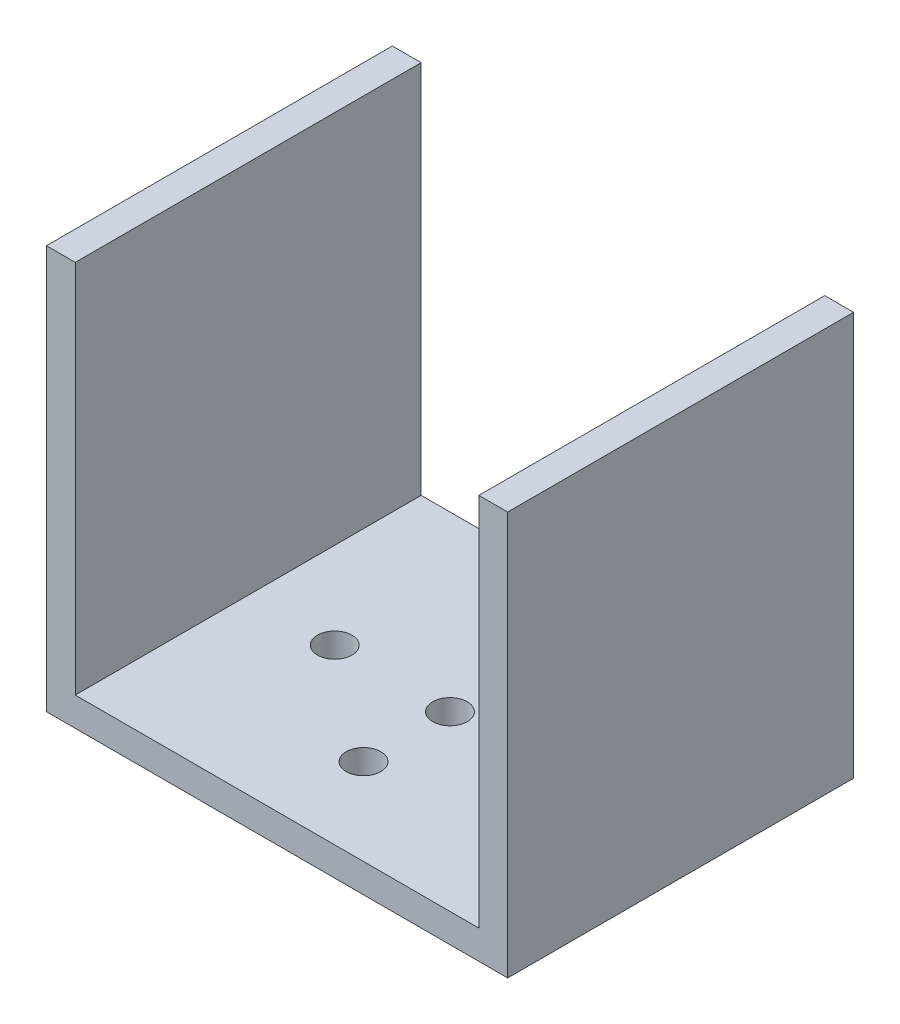
ISO-10303-21;
HEADER;
FILE_DESCRIPTION(('STEP AP214'),'2;1');
FILE_NAME('part.step','',(''),(''),'','','');
FILE_SCHEMA(('AUTOMOTIVE_DESIGN { 1 0 10303 214 1 1 1 1 }'));
ENDSEC;
DATA;
#1=APPLICATION_CONTEXT('core data for automotive mechanical design processes');
#2=APPLICATION_PROTOCOL_DEFINITION('international standard','automotive_design',2000,#1);
#3=PRODUCT_CONTEXT('',#1,'mechanical');
#4=PRODUCT('Part','Part','',(#3));
#5=PRODUCT_RELATED_PRODUCT_CATEGORY('part','',(#4));
#6=PRODUCT_DEFINITION_FORMATION('','',#4);
#7=PRODUCT_DEFINITION_CONTEXT('part definition',#1,'design');
#8=PRODUCT_DEFINITION('design','',#6,#7);
#9=PRODUCT_DEFINITION_SHAPE('','',#8);
#10=(LENGTH_UNIT() NAMED_UNIT(*) SI_UNIT(.MILLI.,.METRE.));
#11=(NAMED_UNIT(*) PLANE_ANGLE_UNIT() SI_UNIT($,.RADIAN.));
#12=(NAMED_UNIT(*) SI_UNIT($,.STERADIAN.) SOLID_ANGLE_UNIT());
#13=UNCERTAINTY_MEASURE_WITH_UNIT(LENGTH_MEASURE(1.E-05),#10,'distance_accuracy_value','');
#14=(GEOMETRIC_REPRESENTATION_CONTEXT(3) GLOBAL_UNCERTAINTY_ASSIGNED_CONTEXT((#13)) GLOBAL_UNIT_ASSIGNED_CONTEXT((#10,
#11,#12)) REPRESENTATION_CONTEXT('',''));
#15=CARTESIAN_POINT('',(0.,0.,0.));
#16=DIRECTION('',(0.,0.,1.));
#17=DIRECTION('',(1.,0.,0.));
#18=AXIS2_PLACEMENT_3D('',#15,#16,#17);
#19=CARTESIAN_POINT('',(0.,4.99999999999999,-60.));
#20=DIRECTION('',(0.,1.,0.));
#21=DIRECTION('',(-1.,0.,0.));
#22=AXIS2_PLACEMENT_3D('',#19,#20,#21);
#23=PLANE('',#22);
#24=CARTESIAN_POINT('',(20.,4.99999999999999,-30.));
#25=DIRECTION('',(0.,1.,0.));
#26=DIRECTION('',(-1.,0.,0.));
#27=AXIS2_PLACEMENT_3D('',#24,#25,#26);
#28=CIRCLE('',#27,3.);
#29=CARTESIAN_POINT('',(17.,4.99999999999999,-30.));
#30=VERTEX_POINT('',#29);
#31=EDGE_CURVE('E252',#30,#30,#28,.T.);
#32=ORIENTED_EDGE('',*,*,#31,.F.);
#33=EDGE_LOOP('',(#32));
#34=FACE_BOUND('',#33,.T.);
#35=CARTESIAN_POINT('',(40.,4.99999999999999,-45.));
#36=DIRECTION('',(0.,1.,0.));
#37=DIRECTION('',(-1.,0.,0.));
#38=AXIS2_PLACEMENT_3D('',#35,#36,#37);
#39=CIRCLE('',#38,2.99999999999999);
#40=CARTESIAN_POINT('',(37.,4.99999999999999,-45.));
#41=VERTEX_POINT('',#40);
#42=EDGE_CURVE('E243',#41,#41,#39,.T.);
#43=ORIENTED_EDGE('',*,*,#42,.F.);
#44=EDGE_LOOP('',(#43));
#45=FACE_BOUND('',#44,.T.);
#46=CARTESIAN_POINT('',(40.,4.99999999999999,-15.));
#47=DIRECTION('',(0.,1.,0.));
#48=DIRECTION('',(1.,0.,0.));
#49=AXIS2_PLACEMENT_3D('',#46,#47,#48);
#50=CIRCLE('',#49,2.99999999999999);
#51=CARTESIAN_POINT('',(43.,4.99999999999999,-15.));
#52=VERTEX_POINT('',#51);
#53=EDGE_CURVE('E267',#52,#52,#50,.T.);
#54=ORIENTED_EDGE('',*,*,#53,.F.);
#55=EDGE_LOOP('',(#54));
#56=FACE_BOUND('',#55,.T.);
#57=CARTESIAN_POINT('',(60.,5.,-30.));
#58=DIRECTION('',(0.,1.,0.));
#59=DIRECTION('',(1.,0.,0.));
#60=AXIS2_PLACEMENT_3D('',#57,#58,#59);
#61=CIRCLE('',#60,3.00000000000001);
#62=CARTESIAN_POINT('',(63.,5.,-30.));
#63=VERTEX_POINT('',#62);
#64=EDGE_CURVE('E259',#63,#63,#61,.T.);
#65=ORIENTED_EDGE('',*,*,#64,.F.);
#66=EDGE_LOOP('',(#65));
#67=FACE_BOUND('',#66,.T.);
#68=CARTESIAN_POINT('',(40.,4.99999999999999,-30.));
#69=DIRECTION('',(0.,1.,0.));
#70=DIRECTION('',(-1.,0.,0.));
#71=AXIS2_PLACEMENT_3D('',#68,#69,#70);
#72=CIRCLE('',#71,3.);
#73=CARTESIAN_POINT('',(37.,4.99999999999999,-30.));
#74=VERTEX_POINT('',#73);
#75=EDGE_CURVE('E235',#74,#74,#72,.T.);
#76=ORIENTED_EDGE('',*,*,#75,.F.);
#77=EDGE_LOOP('',(#76));
#78=FACE_BOUND('',#77,.T.);
#79=DIRECTION('',(-1.,0.,0.));
#80=VECTOR('',#79,1.);
#81=CARTESIAN_POINT('',(0.,4.99999999999999,0.));
#82=LINE('',#81,#80);
#83=CARTESIAN_POINT('',(75.,5.,0.));
#84=VERTEX_POINT('',#83);
#85=CARTESIAN_POINT('',(5.00000000000001,4.99999999999999,0.));
#86=VERTEX_POINT('',#85);
#87=EDGE_CURVE('E145',#84,#86,#82,.T.);
#88=ORIENTED_EDGE('',*,*,#87,.F.);
#89=DIRECTION('',(0.,0.,1.));
#90=VECTOR('',#89,1.);
#91=CARTESIAN_POINT('',(75.,5.,-60.));
#92=LINE('',#91,#90);
#93=CARTESIAN_POINT('',(75.,5.,-60.));
#94=VERTEX_POINT('',#93);
#95=EDGE_CURVE('E11',#94,#84,#92,.T.);
#96=ORIENTED_EDGE('',*,*,#95,.F.);
#97=DIRECTION('',(-1.,0.,0.));
#98=VECTOR('',#97,1.);
#99=CARTESIAN_POINT('',(0.,4.99999999999999,-60.));
#100=LINE('',#99,#98);
#101=CARTESIAN_POINT('',(5.00000000000001,4.99999999999999,-60.));
#102=VERTEX_POINT('',#101);
#103=EDGE_CURVE('E172',#94,#102,#100,.T.);
#104=ORIENTED_EDGE('',*,*,#103,.T.);
#105=DIRECTION('',(0.,0.,1.));
#106=VECTOR('',#105,1.);
#107=CARTESIAN_POINT('',(5.00000000000001,4.99999999999999,-60.));
#108=LINE('',#107,#106);
#109=EDGE_CURVE('E44',#102,#86,#108,.T.);
#110=ORIENTED_EDGE('',*,*,#109,.T.);
#111=EDGE_LOOP('',(#88,#96,#104,#110));
#112=FACE_BOUND('',#111,.T.);
#113=ADVANCED_FACE('F41',(#34,#45,#56,#67,#78,#112),#23,.T.);
#114=CARTESIAN_POINT('',(75.,0.,-60.));
#115=DIRECTION('',(-1.,0.,0.));
#116=DIRECTION('',(0.,-1.,0.));
#117=AXIS2_PLACEMENT_3D('',#114,#115,#116);
#118=PLANE('',#117);
#119=DIRECTION('',(0.,-1.,0.));
#120=VECTOR('',#119,1.);
#121=CARTESIAN_POINT('',(75.,0.,0.));
#122=LINE('',#121,#120);
#123=CARTESIAN_POINT('',(75.,70.,0.));
#124=VERTEX_POINT('',#123);
#125=EDGE_CURVE('E169',#124,#84,#122,.T.);
#126=ORIENTED_EDGE('',*,*,#125,.F.);
#127=DIRECTION('',(0.,0.,1.));
#128=VECTOR('',#127,1.);
#129=CARTESIAN_POINT('',(75.,70.,-60.));
#130=LINE('',#129,#128);
#131=CARTESIAN_POINT('',(75.,70.,-60.));
#132=VERTEX_POINT('',#131);
#133=EDGE_CURVE('E51',#132,#124,#130,.T.);
#134=ORIENTED_EDGE('',*,*,#133,.F.);
#135=DIRECTION('',(0.,-1.,0.));
#136=VECTOR('',#135,1.);
#137=CARTESIAN_POINT('',(75.,0.,-60.));
#138=LINE('',#137,#136);
#139=EDGE_CURVE('E130',#132,#94,#138,.T.);
#140=ORIENTED_EDGE('',*,*,#139,.T.);
#141=ORIENTED_EDGE('',*,*,#95,.T.);
#142=EDGE_LOOP('',(#126,#134,#140,#141));
#143=FACE_BOUND('',#142,.T.);
#144=ADVANCED_FACE('F190',(#143),#118,.T.);
#145=CARTESIAN_POINT('',(0.,70.,-60.));
#146=DIRECTION('',(0.,1.,0.));
#147=DIRECTION('',(-1.,0.,0.));
#148=AXIS2_PLACEMENT_3D('',#145,#146,#147);
#149=PLANE('',#148);
#150=DIRECTION('',(-1.,0.,0.));
#151=VECTOR('',#150,1.);
#152=CARTESIAN_POINT('',(0.,70.,0.));
#153=LINE('',#152,#151);
#154=CARTESIAN_POINT('',(80.,70.,0.));
#155=VERTEX_POINT('',#154);
#156=EDGE_CURVE('E116',#155,#124,#153,.T.);
#157=ORIENTED_EDGE('',*,*,#156,.F.);
#158=DIRECTION('',(0.,0.,1.));
#159=VECTOR('',#158,1.);
#160=CARTESIAN_POINT('',(80.,70.,-60.));
#161=LINE('',#160,#159);
#162=CARTESIAN_POINT('',(80.,70.,-60.));
#163=VERTEX_POINT('',#162);
#164=EDGE_CURVE('E111',#163,#155,#161,.T.);
#165=ORIENTED_EDGE('',*,*,#164,.F.);
#166=DIRECTION('',(-1.,0.,0.));
#167=VECTOR('',#166,1.);
#168=CARTESIAN_POINT('',(0.,70.,-60.));
#169=LINE('',#168,#167);
#170=EDGE_CURVE('E114',#163,#132,#169,.T.);
#171=ORIENTED_EDGE('',*,*,#170,.T.);
#172=ORIENTED_EDGE('',*,*,#133,.T.);
#173=EDGE_LOOP('',(#157,#165,#171,#172));
#174=FACE_BOUND('',#173,.T.);
#175=ADVANCED_FACE('F113',(#174),#149,.T.);
#176=CARTESIAN_POINT('',(80.,0.,-60.));
#177=DIRECTION('',(1.,0.,0.));
#178=DIRECTION('',(0.,0.,-1.));
#179=AXIS2_PLACEMENT_3D('',#176,#177,#178);
#180=PLANE('',#179);
#181=DIRECTION('',(0.,1.,0.));
#182=VECTOR('',#181,1.);
#183=CARTESIAN_POINT('',(80.,0.,0.));
#184=LINE('',#183,#182);
#185=CARTESIAN_POINT('',(80.,0.,0.));
#186=VERTEX_POINT('',#185);
#187=EDGE_CURVE('E166',#186,#155,#184,.T.);
#188=ORIENTED_EDGE('',*,*,#187,.F.);
#189=DIRECTION('',(0.,0.,1.));
#190=VECTOR('',#189,1.);
#191=CARTESIAN_POINT('',(80.,0.,-60.));
#192=LINE('',#191,#190);
#193=CARTESIAN_POINT('',(80.,0.,-60.));
#194=VERTEX_POINT('',#193);
#195=EDGE_CURVE('E122',#194,#186,#192,.T.);
#196=ORIENTED_EDGE('',*,*,#195,.F.);
#197=DIRECTION('',(0.,1.,0.));
#198=VECTOR('',#197,1.);
#199=CARTESIAN_POINT('',(80.,0.,-60.));
#200=LINE('',#199,#198);
#201=EDGE_CURVE('E128',#194,#163,#200,.T.);
#202=ORIENTED_EDGE('',*,*,#201,.T.);
#203=ORIENTED_EDGE('',*,*,#164,.T.);
#204=EDGE_LOOP('',(#188,#196,#202,#203));
#205=FACE_BOUND('',#204,.T.);
#206=ADVANCED_FACE('F134',(#205),#180,.T.);
#207=CARTESIAN_POINT('',(0.,0.,-60.));
#208=DIRECTION('',(0.,-1.,0.));
#209=DIRECTION('',(0.,0.,-1.));
#210=AXIS2_PLACEMENT_3D('',#207,#208,#209);
#211=PLANE('',#210);
#212=CARTESIAN_POINT('',(20.,0.,-30.));
#213=DIRECTION('',(0.,1.,0.));
#214=DIRECTION('',(-1.,0.,0.));
#215=AXIS2_PLACEMENT_3D('',#212,#213,#214);
#216=CIRCLE('',#215,3.);
#217=CARTESIAN_POINT('',(17.,0.,-30.));
#218=VERTEX_POINT('',#217);
#219=EDGE_CURVE('E239',#218,#218,#216,.T.);
#220=ORIENTED_EDGE('',*,*,#219,.T.);
#221=EDGE_LOOP('',(#220));
#222=FACE_BOUND('',#221,.T.);
#223=CARTESIAN_POINT('',(40.,0.,-45.));
#224=DIRECTION('',(0.,1.,0.));
#225=DIRECTION('',(-1.,0.,0.));
#226=AXIS2_PLACEMENT_3D('',#223,#224,#225);
#227=CIRCLE('',#226,2.99999999999999);
#228=CARTESIAN_POINT('',(37.,0.,-45.));
#229=VERTEX_POINT('',#228);
#230=EDGE_CURVE('E247',#229,#229,#227,.T.);
#231=ORIENTED_EDGE('',*,*,#230,.T.);
#232=EDGE_LOOP('',(#231));
#233=FACE_BOUND('',#232,.T.);
#234=CARTESIAN_POINT('',(40.,0.,-15.));
#235=DIRECTION('',(0.,1.,0.));
#236=DIRECTION('',(1.,0.,0.));
#237=AXIS2_PLACEMENT_3D('',#234,#235,#236);
#238=CIRCLE('',#237,2.99999999999999);
#239=CARTESIAN_POINT('',(43.,0.,-15.));
#240=VERTEX_POINT('',#239);
#241=EDGE_CURVE('E248',#240,#240,#238,.T.);
#242=ORIENTED_EDGE('',*,*,#241,.T.);
#243=EDGE_LOOP('',(#242));
#244=FACE_BOUND('',#243,.T.);
#245=CARTESIAN_POINT('',(60.,0.,-30.));
#246=DIRECTION('',(0.,1.,0.));
#247=DIRECTION('',(1.,0.,0.));
#248=AXIS2_PLACEMENT_3D('',#245,#246,#247);
#249=CIRCLE('',#248,3.00000000000001);
#250=CARTESIAN_POINT('',(63.,0.,-30.));
#251=VERTEX_POINT('',#250);
#252=EDGE_CURVE('E263',#251,#251,#249,.T.);
#253=ORIENTED_EDGE('',*,*,#252,.T.);
#254=EDGE_LOOP('',(#253));
#255=FACE_BOUND('',#254,.T.);
#256=CARTESIAN_POINT('',(40.,0.,-30.));
#257=DIRECTION('',(0.,1.,0.));
#258=DIRECTION('',(-1.,0.,0.));
#259=AXIS2_PLACEMENT_3D('',#256,#257,#258);
#260=CIRCLE('',#259,3.);
#261=CARTESIAN_POINT('',(37.,0.,-30.));
#262=VERTEX_POINT('',#261);
#263=EDGE_CURVE('E150',#262,#262,#260,.T.);
#264=ORIENTED_EDGE('',*,*,#263,.T.);
#265=EDGE_LOOP('',(#264));
#266=FACE_BOUND('',#265,.T.);
#267=DIRECTION('',(1.,0.,0.));
#268=VECTOR('',#267,1.);
#269=CARTESIAN_POINT('',(0.,0.,0.));
#270=LINE('',#269,#268);
#271=CARTESIAN_POINT('',(0.,0.,0.));
#272=VERTEX_POINT('',#271);
#273=EDGE_CURVE('E162',#272,#186,#270,.T.);
#274=ORIENTED_EDGE('',*,*,#273,.F.);
#275=DIRECTION('',(0.,0.,1.));
#276=VECTOR('',#275,1.);
#277=CARTESIAN_POINT('',(0.,0.,-60.));
#278=LINE('',#277,#276);
#279=CARTESIAN_POINT('',(0.,0.,-60.));
#280=VERTEX_POINT('',#279);
#281=EDGE_CURVE('E178',#280,#272,#278,.T.);
#282=ORIENTED_EDGE('',*,*,#281,.F.);
#283=DIRECTION('',(1.,0.,0.));
#284=VECTOR('',#283,1.);
#285=CARTESIAN_POINT('',(0.,0.,-60.));
#286=LINE('',#285,#284);
#287=EDGE_CURVE('E136',#280,#194,#286,.T.);
#288=ORIENTED_EDGE('',*,*,#287,.T.);
#289=ORIENTED_EDGE('',*,*,#195,.T.);
#290=EDGE_LOOP('',(#274,#282,#288,#289));
#291=FACE_BOUND('',#290,.T.);
#292=ADVANCED_FACE('F205',(#222,#233,#244,#255,#266,#291),#211,.T.);
#293=CARTESIAN_POINT('',(0.,0.,-60.));
#294=DIRECTION('',(-1.,0.,0.));
#295=DIRECTION('',(0.,-1.,0.));
#296=AXIS2_PLACEMENT_3D('',#293,#294,#295);
#297=PLANE('',#296);
#298=DIRECTION('',(0.,-1.,0.));
#299=VECTOR('',#298,1.);
#300=CARTESIAN_POINT('',(0.,0.,0.));
#301=LINE('',#300,#299);
#302=CARTESIAN_POINT('',(0.,70.,0.));
#303=VERTEX_POINT('',#302);
#304=EDGE_CURVE('E158',#303,#272,#301,.T.);
#305=ORIENTED_EDGE('',*,*,#304,.F.);
#306=DIRECTION('',(0.,0.,1.));
#307=VECTOR('',#306,1.);
#308=CARTESIAN_POINT('',(0.,70.,-60.));
#309=LINE('',#308,#307);
#310=CARTESIAN_POINT('',(0.,70.,-60.));
#311=VERTEX_POINT('',#310);
#312=EDGE_CURVE('E181',#311,#303,#309,.T.);
#313=ORIENTED_EDGE('',*,*,#312,.F.);
#314=DIRECTION('',(0.,-1.,0.));
#315=VECTOR('',#314,1.);
#316=CARTESIAN_POINT('',(0.,0.,-60.));
#317=LINE('',#316,#315);
#318=EDGE_CURVE('E139',#311,#280,#317,.T.);
#319=ORIENTED_EDGE('',*,*,#318,.T.);
#320=ORIENTED_EDGE('',*,*,#281,.T.);
#321=EDGE_LOOP('',(#305,#313,#319,#320));
#322=FACE_BOUND('',#321,.T.);
#323=ADVANCED_FACE('F208',(#322),#297,.T.);
#324=CARTESIAN_POINT('',(5.00000000000001,70.,0.));
#325=VERTEX_POINT('',#324);
#326=EDGE_CURVE('E154',#325,#303,#153,.T.);
#327=ORIENTED_EDGE('',*,*,#326,.F.);
#328=DIRECTION('',(0.,0.,1.));
#329=VECTOR('',#328,1.);
#330=CARTESIAN_POINT('',(5.00000000000001,70.,-60.));
#331=LINE('',#330,#329);
#332=CARTESIAN_POINT('',(5.00000000000001,70.,-60.));
#333=VERTEX_POINT('',#332);
#334=EDGE_CURVE('E183',#333,#325,#331,.T.);
#335=ORIENTED_EDGE('',*,*,#334,.F.);
#336=EDGE_CURVE('E133',#333,#311,#169,.T.);
#337=ORIENTED_EDGE('',*,*,#336,.T.);
#338=ORIENTED_EDGE('',*,*,#312,.T.);
#339=EDGE_LOOP('',(#327,#335,#337,#338));
#340=FACE_BOUND('',#339,.T.);
#341=ADVANCED_FACE('F198',(#340),#149,.T.);
#342=CARTESIAN_POINT('',(5.00000000000001,0.,-60.));
#343=DIRECTION('',(1.,0.,0.));
#344=DIRECTION('',(0.,0.,-1.));
#345=AXIS2_PLACEMENT_3D('',#342,#343,#344);
#346=PLANE('',#345);
#347=DIRECTION('',(0.,1.,0.));
#348=VECTOR('',#347,1.);
#349=CARTESIAN_POINT('',(5.00000000000001,0.,0.));
#350=LINE('',#349,#348);
#351=EDGE_CURVE('E149',#86,#325,#350,.T.);
#352=ORIENTED_EDGE('',*,*,#351,.F.);
#353=ORIENTED_EDGE('',*,*,#109,.F.);
#354=DIRECTION('',(0.,1.,0.));
#355=VECTOR('',#354,1.);
#356=CARTESIAN_POINT('',(5.00000000000001,0.,-60.));
#357=LINE('',#356,#355);
#358=EDGE_CURVE('E229',#102,#333,#357,.T.);
#359=ORIENTED_EDGE('',*,*,#358,.T.);
#360=ORIENTED_EDGE('',*,*,#334,.T.);
#361=EDGE_LOOP('',(#352,#353,#359,#360));
#362=FACE_BOUND('',#361,.T.);
#363=ADVANCED_FACE('F187',(#362),#346,.T.);
#364=CARTESIAN_POINT('',(0.,0.,-60.));
#365=DIRECTION('',(0.,0.,1.));
#366=DIRECTION('',(1.,0.,0.));
#367=AXIS2_PLACEMENT_3D('',#364,#365,#366);
#368=PLANE('',#367);
#369=ORIENTED_EDGE('',*,*,#103,.F.);
#370=ORIENTED_EDGE('',*,*,#139,.F.);
#371=ORIENTED_EDGE('',*,*,#170,.F.);
#372=ORIENTED_EDGE('',*,*,#201,.F.);
#373=ORIENTED_EDGE('',*,*,#287,.F.);
#374=ORIENTED_EDGE('',*,*,#318,.F.);
#375=ORIENTED_EDGE('',*,*,#336,.F.);
#376=ORIENTED_EDGE('',*,*,#358,.F.);
#377=EDGE_LOOP('',(#369,#370,#371,#372,#373,#374,#375,#376));
#378=FACE_BOUND('',#377,.T.);
#379=ADVANCED_FACE('F126',(#378),#368,.F.);
#380=CARTESIAN_POINT('',(0.,0.,0.));
#381=DIRECTION('',(0.,0.,1.));
#382=DIRECTION('',(1.,0.,0.));
#383=AXIS2_PLACEMENT_3D('',#380,#381,#382);
#384=PLANE('',#383);
#385=ORIENTED_EDGE('',*,*,#87,.T.);
#386=ORIENTED_EDGE('',*,*,#351,.T.);
#387=ORIENTED_EDGE('',*,*,#326,.T.);
#388=ORIENTED_EDGE('',*,*,#304,.T.);
#389=ORIENTED_EDGE('',*,*,#273,.T.);
#390=ORIENTED_EDGE('',*,*,#187,.T.);
#391=ORIENTED_EDGE('',*,*,#156,.T.);
#392=ORIENTED_EDGE('',*,*,#125,.T.);
#393=EDGE_LOOP('',(#385,#386,#387,#388,#389,#390,#391,#392));
#394=FACE_BOUND('',#393,.T.);
#395=ADVANCED_FACE('F189',(#394),#384,.T.);
#396=CARTESIAN_POINT('',(40.,0.,-30.));
#397=DIRECTION('',(0.,1.,0.));
#398=DIRECTION('',(-1.,0.,0.));
#399=AXIS2_PLACEMENT_3D('',#396,#397,#398);
#400=CYLINDRICAL_SURFACE('',#399,3.);
#401=ORIENTED_EDGE('',*,*,#263,.F.);
#402=EDGE_LOOP('',(#401));
#403=FACE_BOUND('',#402,.T.);
#404=ORIENTED_EDGE('',*,*,#75,.T.);
#405=EDGE_LOOP('',(#404));
#406=FACE_BOUND('',#405,.T.);
#407=ADVANCED_FACE('F290',(#403,#406),#400,.F.);
#408=CARTESIAN_POINT('',(60.,0.,-30.));
#409=DIRECTION('',(0.,1.,0.));
#410=DIRECTION('',(-1.,0.,0.));
#411=AXIS2_PLACEMENT_3D('',#408,#409,#410);
#412=CYLINDRICAL_SURFACE('',#411,3.00000000000001);
#413=ORIENTED_EDGE('',*,*,#252,.F.);
#414=EDGE_LOOP('',(#413));
#415=FACE_BOUND('',#414,.T.);
#416=ORIENTED_EDGE('',*,*,#64,.T.);
#417=EDGE_LOOP('',(#416));
#418=FACE_BOUND('',#417,.T.);
#419=ADVANCED_FACE('F281',(#415,#418),#412,.F.);
#420=CARTESIAN_POINT('',(40.,0.,-15.));
#421=DIRECTION('',(0.,1.,0.));
#422=DIRECTION('',(-1.,0.,0.));
#423=AXIS2_PLACEMENT_3D('',#420,#421,#422);
#424=CYLINDRICAL_SURFACE('',#423,2.99999999999999);
#425=ORIENTED_EDGE('',*,*,#241,.F.);
#426=EDGE_LOOP('',(#425));
#427=FACE_BOUND('',#426,.T.);
#428=ORIENTED_EDGE('',*,*,#53,.T.);
#429=EDGE_LOOP('',(#428));
#430=FACE_BOUND('',#429,.T.);
#431=ADVANCED_FACE('F277',(#427,#430),#424,.F.);
#432=CARTESIAN_POINT('',(40.,0.,-45.));
#433=DIRECTION('',(0.,1.,0.));
#434=DIRECTION('',(-1.,0.,0.));
#435=AXIS2_PLACEMENT_3D('',#432,#433,#434);
#436=CYLINDRICAL_SURFACE('',#435,2.99999999999999);
#437=ORIENTED_EDGE('',*,*,#230,.F.);
#438=EDGE_LOOP('',(#437));
#439=FACE_BOUND('',#438,.T.);
#440=ORIENTED_EDGE('',*,*,#42,.T.);
#441=EDGE_LOOP('',(#440));
#442=FACE_BOUND('',#441,.T.);
#443=ADVANCED_FACE('F280',(#439,#442),#436,.F.);
#444=CARTESIAN_POINT('',(20.,0.,-30.));
#445=DIRECTION('',(0.,1.,0.));
#446=DIRECTION('',(-1.,0.,0.));
#447=AXIS2_PLACEMENT_3D('',#444,#445,#446);
#448=CYLINDRICAL_SURFACE('',#447,3.);
#449=ORIENTED_EDGE('',*,*,#219,.F.);
#450=EDGE_LOOP('',(#449));
#451=FACE_BOUND('',#450,.T.);
#452=ORIENTED_EDGE('',*,*,#31,.T.);
#453=EDGE_LOOP('',(#452));
#454=FACE_BOUND('',#453,.T.);
#455=ADVANCED_FACE('F304',(#451,#454),#448,.F.);
#456=CLOSED_SHELL('',(#113,#144,#175,#206,#292,#323,#341,#363,#379,#395,#407,#419,#431,#443,#455));
#457=MANIFOLD_SOLID_BREP('B2',#456);
#458=ADVANCED_BREP_SHAPE_REPRESENTATION('',(#18,#457),#14);
#459=SHAPE_DEFINITION_REPRESENTATION(#9,#458);
ENDSEC;
END-ISO-10303-21;
